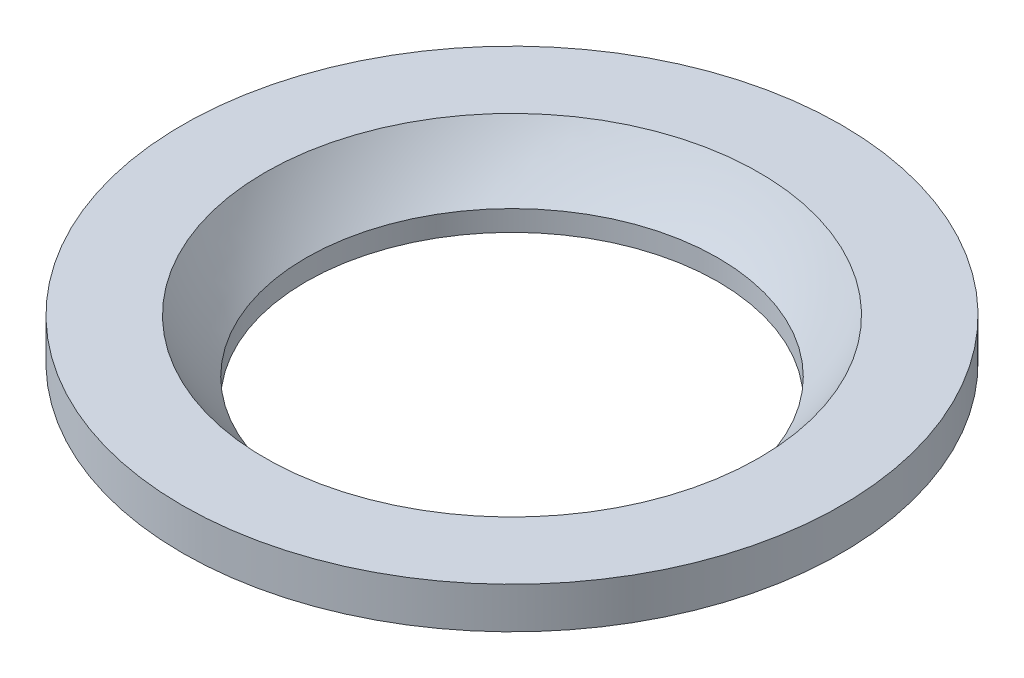
ISO-10303-21;
HEADER;
FILE_DESCRIPTION(('STEP AP214'),'2;1');
FILE_NAME('part.step','',(''),(''),'','','');
FILE_SCHEMA(('AUTOMOTIVE_DESIGN { 1 0 10303 214 1 1 1 1 }'));
ENDSEC;
DATA;
#1=APPLICATION_CONTEXT('core data for automotive mechanical design processes');
#2=APPLICATION_PROTOCOL_DEFINITION('international standard','automotive_design',2000,#1);
#3=PRODUCT_CONTEXT('',#1,'mechanical');
#4=PRODUCT('Part','Part','',(#3));
#5=PRODUCT_RELATED_PRODUCT_CATEGORY('part','',(#4));
#6=PRODUCT_DEFINITION_FORMATION('','',#4);
#7=PRODUCT_DEFINITION_CONTEXT('part definition',#1,'design');
#8=PRODUCT_DEFINITION('design','',#6,#7);
#9=PRODUCT_DEFINITION_SHAPE('','',#8);
#10=(LENGTH_UNIT() NAMED_UNIT(*) SI_UNIT(.MILLI.,.METRE.));
#11=(NAMED_UNIT(*) PLANE_ANGLE_UNIT() SI_UNIT($,.RADIAN.));
#12=(NAMED_UNIT(*) SI_UNIT($,.STERADIAN.) SOLID_ANGLE_UNIT());
#13=UNCERTAINTY_MEASURE_WITH_UNIT(LENGTH_MEASURE(1.E-05),#10,'distance_accuracy_value','');
#14=(GEOMETRIC_REPRESENTATION_CONTEXT(3) GLOBAL_UNCERTAINTY_ASSIGNED_CONTEXT((#13)) GLOBAL_UNIT_ASSIGNED_CONTEXT((#10,
#11,#12)) REPRESENTATION_CONTEXT('',''));
#15=CARTESIAN_POINT('',(0.,0.,0.));
#16=DIRECTION('',(0.,0.,1.));
#17=DIRECTION('',(1.,0.,0.));
#18=AXIS2_PLACEMENT_3D('',#15,#16,#17);
#19=CARTESIAN_POINT('',(0.,0.,0.));
#20=DIRECTION('',(0.,1.,0.));
#21=DIRECTION('',(1.,0.,0.));
#22=AXIS2_PLACEMENT_3D('',#19,#20,#21);
#23=SPHERICAL_SURFACE('',#22,7.);
#24=CARTESIAN_POINT('',(0.,-4.89897948556636,0.));
#25=DIRECTION('',(0.,1.,0.));
#26=DIRECTION('',(0.,0.,1.));
#27=AXIS2_PLACEMENT_3D('',#24,#25,#26);
#28=CIRCLE('',#27,5.);
#29=CARTESIAN_POINT('',(5.,-4.89897948556636,0.));
#30=VERTEX_POINT('',#29);
#31=EDGE_CURVE('E10',#30,#30,#28,.T.);
#32=CARTESIAN_POINT('',(0.,-3.60555127546399,0.));
#33=DIRECTION('',(0.,1.,0.));
#34=DIRECTION('',(0.,0.,1.));
#35=AXIS2_PLACEMENT_3D('',#32,#33,#34);
#36=CIRCLE('',#35,6.);
#37=CARTESIAN_POINT('',(6.,-3.60555127546399,0.));
#38=VERTEX_POINT('',#37);
#39=EDGE_CURVE('E52',#38,#38,#36,.T.);
#40=CARTESIAN_POINT('',(5.,-4.89897948556636,0.));
#41=CARTESIAN_POINT('',(5.01194605248676,-4.88678709851703,0.));
#42=CARTESIAN_POINT('',(5.02384750698286,-4.87455101456072,0.));
#43=CARTESIAN_POINT('',(5.04756058687498,-4.84999211131285,0.));
#44=CARTESIAN_POINT('',(5.05937221227101,-4.83766929202127,0.));
#45=CARTESIAN_POINT('',(5.08290500084421,-4.81293757658154,0.));
#46=CARTESIAN_POINT('',(5.09462616402139,-4.80052868043339,0.));
#47=CARTESIAN_POINT('',(5.11797740116735,-4.77562547560934,0.));
#48=CARTESIAN_POINT('',(5.12960747513612,-4.76313116693345,0.));
#49=CARTESIAN_POINT('',(5.15277591140522,-4.73805780562039,0.));
#50=CARTESIAN_POINT('',(5.16431427370555,-4.72547875298323,0.));
#51=CARTESIAN_POINT('',(5.1872986691782,-4.70023657693851,0.));
#52=CARTESIAN_POINT('',(5.19874470235051,-4.68757345353094,0.));
#53=CARTESIAN_POINT('',(5.22154382702377,-4.66216381361143,0.));
#54=CARTESIAN_POINT('',(5.23289691852473,-4.64941729709947,0.));
#55=CARTESIAN_POINT('',(5.25550955229239,-4.6238415531064,0.));
#56=CARTESIAN_POINT('',(5.2667690945591,-4.61101232562529,0.));
#57=CARTESIAN_POINT('',(5.28919402729993,-4.58527184625371,0.));
#58=CARTESIAN_POINT('',(5.30035941777404,-4.57236059436326,0.));
#59=CARTESIAN_POINT('',(5.32259544941034,-4.54645675712283,0.));
#60=CARTESIAN_POINT('',(5.33366609057254,-4.53346417177287,0.));
#61=CARTESIAN_POINT('',(5.35571203113612,-4.50739836291575,0.));
#62=CARTESIAN_POINT('',(5.3666873305375,-4.49432513940859,0.));
#63=CARTESIAN_POINT('',(5.38854200023282,-4.46809875385477,0.));
#64=CARTESIAN_POINT('',(5.39942137052676,-4.45494559180812,0.));
#65=CARTESIAN_POINT('',(5.42108359979425,-4.42856003307097,0.));
#66=CARTESIAN_POINT('',(5.43186645876779,-4.41532763638046,0.));
#67=CARTESIAN_POINT('',(5.45333508834637,-4.38878431649152,0.));
#68=CARTESIAN_POINT('',(5.4640208589514,-4.37547339329308,0.));
#69=CARTESIAN_POINT('',(5.48529473994055,-4.34877373272653,0.));
#70=CARTESIAN_POINT('',(5.49588285032466,-4.33538499535843,0.));
#71=CARTESIAN_POINT('',(5.51696084424587,-4.30853042295509,0.));
#72=CARTESIAN_POINT('',(5.52745072778298,-4.29506458791985,0.));
#73=CARTESIAN_POINT('',(5.54833170664073,-4.26805654081069,0.));
#74=CARTESIAN_POINT('',(5.55872280196138,-4.25451432873675,0.));
#75=CARTESIAN_POINT('',(5.57940564830346,-4.22735425226597,0.));
#76=CARTESIAN_POINT('',(5.58969739932489,-4.21373638786912,0.));
#77=CARTESIAN_POINT('',(5.61018100630221,-4.18642573551683,0.));
#78=CARTESIAN_POINT('',(5.6203728622581,-4.17273294756139,0.));
#79=CARTESIAN_POINT('',(5.64065613368394,-4.14527318086583,0.));
#80=CARTESIAN_POINT('',(5.65074754915388,-4.1315062021257,0.));
#81=CARTESIAN_POINT('',(5.67082939956252,-4.10389879060499,0.));
#82=CARTESIAN_POINT('',(5.68081983450122,-4.0900583578244,0.));
#83=CARTESIAN_POINT('',(5.70069918920607,-4.06230477889793,0.));
#84=CARTESIAN_POINT('',(5.71058810897222,-4.04839163275205,0.));
#85=CARTESIAN_POINT('',(5.7302639041233,-4.0204933716614,0.));
#86=CARTESIAN_POINT('',(5.74005077950822,-4.00650825671664,0.));
#87=CARTESIAN_POINT('',(5.75952196214913,-3.97846680644613,0.));
#88=CARTESIAN_POINT('',(5.76920626940511,-3.96441047112038,0.));
#89=CARTESIAN_POINT('',(5.78847179752924,-3.93622733231706,0.));
#90=CARTESIAN_POINT('',(5.79805301839738,-3.92210052883949,0.));
#91=CARTESIAN_POINT('',(5.81711186100421,-3.89377720973318,0.));
#92=CARTESIAN_POINT('',(5.82658948274289,-3.87958069410444,0.));
#93=CARTESIAN_POINT('',(5.84544061989118,-3.8511187104258,0.));
#94=CARTESIAN_POINT('',(5.85481413530079,-3.83685324237591,0.));
#95=CARTESIAN_POINT('',(5.87345655817052,-3.80825411727981,0.));
#96=CARTESIAN_POINT('',(5.88272546563062,-3.79392046023361,0.));
#97=CARTESIAN_POINT('',(5.90115817654963,-3.76518572420095,0.));
#98=CARTESIAN_POINT('',(5.91032198000852,-3.75078464521448,0.));
#99=CARTESIAN_POINT('',(5.92854399260777,-3.72191583603246,0.));
#100=CARTESIAN_POINT('',(5.93760220174812,-3.7074481058369,0.));
#101=CARTESIAN_POINT('',(5.95561254063444,-3.6784467682846,0.));
#102=CARTESIAN_POINT('',(5.96456467038041,-3.66391316092785,0.));
#103=CARTESIAN_POINT('',(5.98236237260698,-3.63478084755999,0.));
#104=CARTESIAN_POINT('',(5.99120794508758,-3.62018214154888,0.));
#105=CARTESIAN_POINT('',(6.,-3.60555127546399,0.));
#106=B_SPLINE_CURVE_WITH_KNOTS('',3,(#40,#41,#42,#43,#44,#45,#46,#47,#48,#49,#50,#51,#52,#53,
#54,#55,#56,#57,#58,#59,#60,#61,#62,#63,#64,#65,#66,#67,#68,#69,#70,#71,#72,#73,#74,#75,#76,#77,
#78,#79,#80,#81,#82,#83,#84,#85,#86,#87,#88,#89,#90,#91,#92,#93,#94,#95,#96,#97,#98,#99,#100,
#101,#102,#103,#104,#105),.UNSPECIFIED.,.F.,.F.,(4,2,2,2,2,2,2,2,2,2,2,2,2,2,2,2,2,2,2,2,2,2,2,
2,2,2,2,2,2,2,2,2,4),(0.,0.051207914924169,0.102415829848339,0.153623744772507,
0.204831659696677,0.256039574620847,0.307247489545016,0.358455404469185,0.409663319393354,
0.460871234317523,0.512079149241693,0.563287064165862,0.614494979090031,0.665702894014201,
0.71691080893837,0.76811872386254,0.819326638786709,0.870534553710878,0.921742468635047,
0.972950383559216,1.02415829848339,1.07536621340755,1.12657412833172,1.17778204325589,
1.22898995818006,1.28019787310423,1.3314057880284,1.38261370295257,1.43382161787674,
1.48502953280091,1.53623744772508,1.58744536264925,1.63865327757342),.UNSPECIFIED.);
#107=EDGE_CURVE('BSEAM30',#30,#38,#106,.T.);
#108=ORIENTED_EDGE('',*,*,#31,.F.);
#109=ORIENTED_EDGE('',*,*,#39,.T.);
#110=ORIENTED_EDGE('',*,*,#107,.T.);
#111=ORIENTED_EDGE('',*,*,#107,.F.);
#112=EDGE_LOOP('',(#108,#110,#109,#111));
#113=FACE_BOUND('',#112,.T.);
#114=ADVANCED_FACE('F30',(#113),#23,.F.);
#115=CARTESIAN_POINT('',(0.,0.,0.));
#116=DIRECTION('',(0.,1.,0.));
#117=DIRECTION('',(0.,0.,1.));
#118=AXIS2_PLACEMENT_3D('',#115,#116,#117);
#119=CYLINDRICAL_SURFACE('',#118,5.);
#120=CARTESIAN_POINT('',(0.,-5.39897948556636,0.));
#121=DIRECTION('',(0.,1.,0.));
#122=DIRECTION('',(0.,0.,1.));
#123=AXIS2_PLACEMENT_3D('',#120,#121,#122);
#124=CIRCLE('',#123,5.);
#125=CARTESIAN_POINT('',(0.,-5.39897948556636,5.));
#126=VERTEX_POINT('',#125);
#127=EDGE_CURVE('E36',#126,#126,#124,.T.);
#128=ORIENTED_EDGE('',*,*,#127,.F.);
#129=EDGE_LOOP('',(#128));
#130=FACE_BOUND('',#129,.T.);
#131=ORIENTED_EDGE('',*,*,#31,.T.);
#132=EDGE_LOOP('',(#131));
#133=FACE_BOUND('',#132,.T.);
#134=ADVANCED_FACE('F77',(#130,#133),#119,.F.);
#135=CARTESIAN_POINT('',(0.,-1.40040748990539,0.));
#136=DIRECTION('',(0.,1.,0.));
#137=DIRECTION('',(0.,0.,1.));
#138=AXIS2_PLACEMENT_3D('',#135,#136,#137);
#139=TOROIDAL_SURFACE('',#138,5.10687373632416,4.);
#140=CARTESIAN_POINT('',(0.,-4.60555127546399,0.));
#141=DIRECTION('',(0.,1.,0.));
#142=DIRECTION('',(0.,0.,1.));
#143=AXIS2_PLACEMENT_3D('',#140,#141,#142);
#144=CIRCLE('',#143,7.5);
#145=CARTESIAN_POINT('',(0.,-4.60555127546399,7.5));
#146=VERTEX_POINT('',#145);
#147=EDGE_CURVE('E40',#146,#146,#144,.T.);
#148=ORIENTED_EDGE('',*,*,#147,.F.);
#149=EDGE_LOOP('',(#148));
#150=FACE_BOUND('',#149,.T.);
#151=ORIENTED_EDGE('',*,*,#127,.T.);
#152=EDGE_LOOP('',(#151));
#153=FACE_BOUND('',#152,.T.);
#154=ADVANCED_FACE('F72',(#150,#153),#139,.T.);
#155=CARTESIAN_POINT('',(8.,-4.60555127546399,0.));
#156=DIRECTION('',(0.,1.,0.));
#157=DIRECTION('',(0.,0.,1.));
#158=AXIS2_PLACEMENT_3D('',#155,#156,#157);
#159=PLANE('',#158);
#160=CARTESIAN_POINT('',(0.,-4.60555127546399,0.));
#161=DIRECTION('',(0.,1.,0.));
#162=DIRECTION('',(0.,0.,1.));
#163=AXIS2_PLACEMENT_3D('',#160,#161,#162);
#164=CIRCLE('',#163,8.);
#165=CARTESIAN_POINT('',(0.,-4.60555127546399,8.));
#166=VERTEX_POINT('',#165);
#167=EDGE_CURVE('E44',#166,#166,#164,.T.);
#168=ORIENTED_EDGE('',*,*,#167,.F.);
#169=EDGE_LOOP('',(#168));
#170=FACE_BOUND('',#169,.T.);
#171=ORIENTED_EDGE('',*,*,#147,.T.);
#172=EDGE_LOOP('',(#171));
#173=FACE_BOUND('',#172,.T.);
#174=ADVANCED_FACE('F66',(#170,#173),#159,.F.);
#175=CARTESIAN_POINT('',(0.,0.,0.));
#176=DIRECTION('',(0.,1.,0.));
#177=DIRECTION('',(0.,0.,1.));
#178=AXIS2_PLACEMENT_3D('',#175,#176,#177);
#179=CYLINDRICAL_SURFACE('',#178,8.);
#180=CARTESIAN_POINT('',(0.,-3.60555127546399,0.));
#181=DIRECTION('',(0.,1.,0.));
#182=DIRECTION('',(0.,0.,1.));
#183=AXIS2_PLACEMENT_3D('',#180,#181,#182);
#184=CIRCLE('',#183,8.);
#185=CARTESIAN_POINT('',(0.,-3.60555127546399,8.));
#186=VERTEX_POINT('',#185);
#187=EDGE_CURVE('E49',#186,#186,#184,.T.);
#188=ORIENTED_EDGE('',*,*,#187,.F.);
#189=EDGE_LOOP('',(#188));
#190=FACE_BOUND('',#189,.T.);
#191=ORIENTED_EDGE('',*,*,#167,.T.);
#192=EDGE_LOOP('',(#191));
#193=FACE_BOUND('',#192,.T.);
#194=ADVANCED_FACE('F60',(#190,#193),#179,.T.);
#195=CARTESIAN_POINT('',(6.,-3.60555127546399,0.));
#196=DIRECTION('',(0.,-1.,0.));
#197=DIRECTION('',(0.,0.,-1.));
#198=AXIS2_PLACEMENT_3D('',#195,#196,#197);
#199=PLANE('',#198);
#200=ORIENTED_EDGE('',*,*,#39,.F.);
#201=EDGE_LOOP('',(#200));
#202=FACE_BOUND('',#201,.T.);
#203=ORIENTED_EDGE('',*,*,#187,.T.);
#204=EDGE_LOOP('',(#203));
#205=FACE_BOUND('',#204,.T.);
#206=ADVANCED_FACE('F57',(#202,#205),#199,.F.);
#207=CLOSED_SHELL('',(#114,#134,#154,#174,#194,#206));
#208=MANIFOLD_SOLID_BREP('B2',#207);
#209=ADVANCED_BREP_SHAPE_REPRESENTATION('',(#18,#208),#14);
#210=SHAPE_DEFINITION_REPRESENTATION(#9,#209);
ENDSEC;
END-ISO-10303-21;
